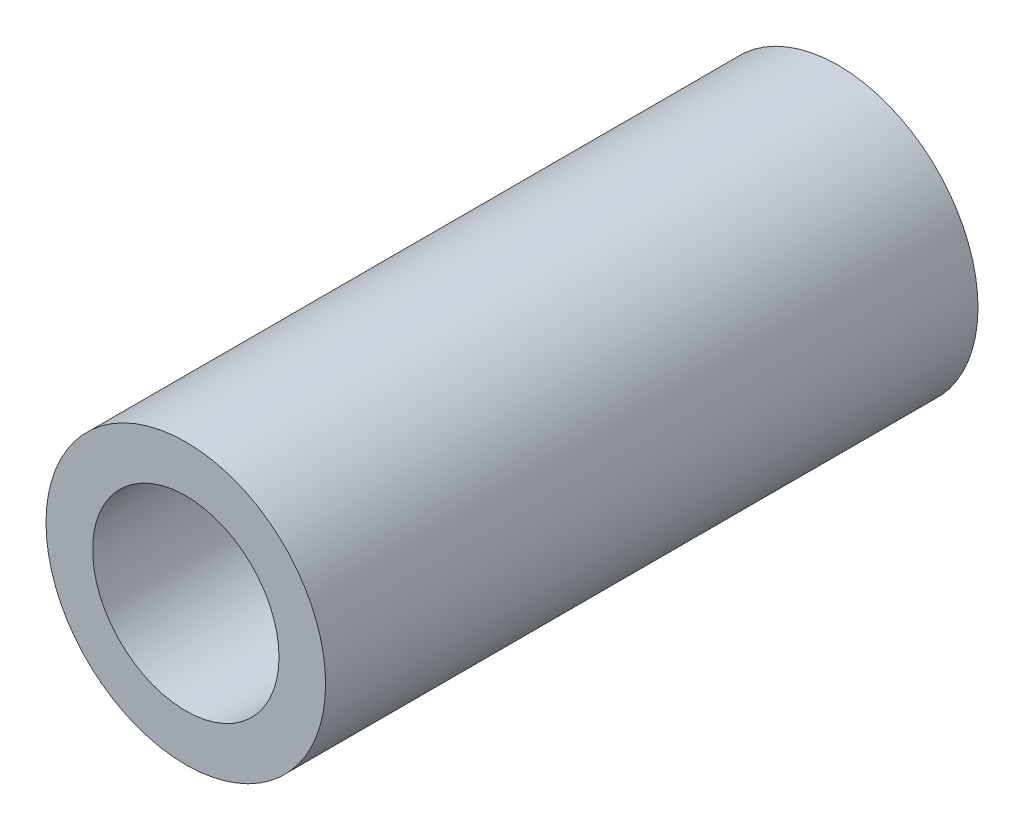
ISO-10303-21;
HEADER;
FILE_DESCRIPTION(('STEP AP214'),'2;1');
FILE_NAME('part.step','',(''),(''),'','','');
FILE_SCHEMA(('AUTOMOTIVE_DESIGN { 1 0 10303 214 1 1 1 1 }'));
ENDSEC;
DATA;
#1=APPLICATION_CONTEXT('core data for automotive mechanical design processes');
#2=APPLICATION_PROTOCOL_DEFINITION('international standard','automotive_design',2000,#1);
#3=PRODUCT_CONTEXT('',#1,'mechanical');
#4=PRODUCT('Part','Part','',(#3));
#5=PRODUCT_RELATED_PRODUCT_CATEGORY('part','',(#4));
#6=PRODUCT_DEFINITION_FORMATION('','',#4);
#7=PRODUCT_DEFINITION_CONTEXT('part definition',#1,'design');
#8=PRODUCT_DEFINITION('design','',#6,#7);
#9=PRODUCT_DEFINITION_SHAPE('','',#8);
#10=(LENGTH_UNIT() NAMED_UNIT(*) SI_UNIT(.MILLI.,.METRE.));
#11=(NAMED_UNIT(*) PLANE_ANGLE_UNIT() SI_UNIT($,.RADIAN.));
#12=(NAMED_UNIT(*) SI_UNIT($,.STERADIAN.) SOLID_ANGLE_UNIT());
#13=UNCERTAINTY_MEASURE_WITH_UNIT(LENGTH_MEASURE(1.E-05),#10,'distance_accuracy_value','');
#14=(GEOMETRIC_REPRESENTATION_CONTEXT(3) GLOBAL_UNCERTAINTY_ASSIGNED_CONTEXT((#13)) GLOBAL_UNIT_ASSIGNED_CONTEXT((#10,
#11,#12)) REPRESENTATION_CONTEXT('',''));
#15=CARTESIAN_POINT('',(0.,0.,0.));
#16=DIRECTION('',(0.,0.,1.));
#17=DIRECTION('',(1.,0.,0.));
#18=AXIS2_PLACEMENT_3D('',#15,#16,#17);
#19=CARTESIAN_POINT('',(0.,0.,14.));
#20=DIRECTION('',(0.,0.,1.));
#21=DIRECTION('',(1.,0.,0.));
#22=AXIS2_PLACEMENT_3D('',#19,#20,#21);
#23=PLANE('',#22);
#24=CARTESIAN_POINT('',(0.,0.,14.));
#25=DIRECTION('',(0.,0.,1.));
#26=DIRECTION('',(1.,0.,0.));
#27=AXIS2_PLACEMENT_3D('',#24,#25,#26);
#28=CIRCLE('',#27,3.);
#29=CARTESIAN_POINT('',(3.,0.,14.));
#30=VERTEX_POINT('',#29);
#31=EDGE_CURVE('E11',#30,#30,#28,.T.);
#32=ORIENTED_EDGE('',*,*,#31,.T.);
#33=EDGE_LOOP('',(#32));
#34=FACE_BOUND('',#33,.T.);
#35=CARTESIAN_POINT('',(0.,0.,14.));
#36=DIRECTION('',(0.,0.,1.));
#37=DIRECTION('',(1.,0.,0.));
#38=AXIS2_PLACEMENT_3D('',#35,#36,#37);
#39=CIRCLE('',#38,2.);
#40=CARTESIAN_POINT('',(2.,0.,14.));
#41=VERTEX_POINT('',#40);
#42=EDGE_CURVE('E48',#41,#41,#39,.T.);
#43=ORIENTED_EDGE('',*,*,#42,.F.);
#44=EDGE_LOOP('',(#43));
#45=FACE_BOUND('',#44,.T.);
#46=ADVANCED_FACE('F37',(#34,#45),#23,.T.);
#47=CARTESIAN_POINT('',(0.,0.,0.));
#48=DIRECTION('',(0.,0.,1.));
#49=DIRECTION('',(1.,0.,0.));
#50=AXIS2_PLACEMENT_3D('',#47,#48,#49);
#51=PLANE('',#50);
#52=CARTESIAN_POINT('',(0.,0.,0.));
#53=DIRECTION('',(0.,0.,1.));
#54=DIRECTION('',(1.,0.,0.));
#55=AXIS2_PLACEMENT_3D('',#52,#53,#54);
#56=CIRCLE('',#55,3.);
#57=CARTESIAN_POINT('',(3.,0.,0.));
#58=VERTEX_POINT('',#57);
#59=EDGE_CURVE('E41',#58,#58,#56,.T.);
#60=ORIENTED_EDGE('',*,*,#59,.F.);
#61=EDGE_LOOP('',(#60));
#62=FACE_BOUND('',#61,.T.);
#63=CARTESIAN_POINT('',(0.,0.,0.));
#64=DIRECTION('',(0.,0.,1.));
#65=DIRECTION('',(1.,0.,0.));
#66=AXIS2_PLACEMENT_3D('',#63,#64,#65);
#67=CIRCLE('',#66,2.);
#68=CARTESIAN_POINT('',(2.,0.,0.));
#69=VERTEX_POINT('',#68);
#70=EDGE_CURVE('E50',#69,#69,#67,.T.);
#71=ORIENTED_EDGE('',*,*,#70,.T.);
#72=EDGE_LOOP('',(#71));
#73=FACE_BOUND('',#72,.T.);
#74=ADVANCED_FACE('F60',(#62,#73),#51,.F.);
#75=CARTESIAN_POINT('',(0.,0.,14.));
#76=DIRECTION('',(0.,0.,-1.));
#77=DIRECTION('',(-1.,0.,0.));
#78=AXIS2_PLACEMENT_3D('',#75,#76,#77);
#79=CYLINDRICAL_SURFACE('',#78,3.);
#80=ORIENTED_EDGE('',*,*,#31,.F.);
#81=EDGE_LOOP('',(#80));
#82=FACE_BOUND('',#81,.T.);
#83=ORIENTED_EDGE('',*,*,#59,.T.);
#84=EDGE_LOOP('',(#83));
#85=FACE_BOUND('',#84,.T.);
#86=ADVANCED_FACE('F39',(#82,#85),#79,.T.);
#87=CARTESIAN_POINT('',(0.,0.,14.));
#88=DIRECTION('',(0.,0.,-1.));
#89=DIRECTION('',(-1.,0.,0.));
#90=AXIS2_PLACEMENT_3D('',#87,#88,#89);
#91=CYLINDRICAL_SURFACE('',#90,2.);
#92=ORIENTED_EDGE('',*,*,#42,.T.);
#93=EDGE_LOOP('',(#92));
#94=FACE_BOUND('',#93,.T.);
#95=ORIENTED_EDGE('',*,*,#70,.F.);
#96=EDGE_LOOP('',(#95));
#97=FACE_BOUND('',#96,.T.);
#98=ADVANCED_FACE('F56',(#94,#97),#91,.F.);
#99=CLOSED_SHELL('',(#46,#74,#86,#98));
#100=MANIFOLD_SOLID_BREP('B2',#99);
#101=ADVANCED_BREP_SHAPE_REPRESENTATION('',(#18,#100),#14);
#102=SHAPE_DEFINITION_REPRESENTATION(#9,#101);
ENDSEC;
END-ISO-10303-21;
